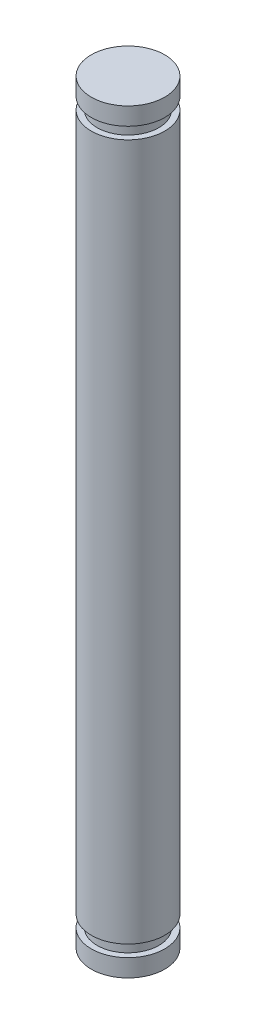
ISO-10303-21;
HEADER;
FILE_DESCRIPTION(('STEP AP214'),'2;1');
FILE_NAME('part.step','',(''),(''),'','','');
FILE_SCHEMA(('AUTOMOTIVE_DESIGN { 1 0 10303 214 1 1 1 1 }'));
ENDSEC;
DATA;
#1=APPLICATION_CONTEXT('core data for automotive mechanical design processes');
#2=APPLICATION_PROTOCOL_DEFINITION('international standard','automotive_design',2000,#1);
#3=PRODUCT_CONTEXT('',#1,'mechanical');
#4=PRODUCT('Part','Part','',(#3));
#5=PRODUCT_RELATED_PRODUCT_CATEGORY('part','',(#4));
#6=PRODUCT_DEFINITION_FORMATION('','',#4);
#7=PRODUCT_DEFINITION_CONTEXT('part definition',#1,'design');
#8=PRODUCT_DEFINITION('design','',#6,#7);
#9=PRODUCT_DEFINITION_SHAPE('','',#8);
#10=(LENGTH_UNIT() NAMED_UNIT(*) SI_UNIT(.MILLI.,.METRE.));
#11=(NAMED_UNIT(*) PLANE_ANGLE_UNIT() SI_UNIT($,.RADIAN.));
#12=(NAMED_UNIT(*) SI_UNIT($,.STERADIAN.) SOLID_ANGLE_UNIT());
#13=UNCERTAINTY_MEASURE_WITH_UNIT(LENGTH_MEASURE(1.E-05),#10,'distance_accuracy_value','');
#14=(GEOMETRIC_REPRESENTATION_CONTEXT(3) GLOBAL_UNCERTAINTY_ASSIGNED_CONTEXT((#13)) GLOBAL_UNIT_ASSIGNED_CONTEXT((#10,
#11,#12)) REPRESENTATION_CONTEXT('',''));
#15=CARTESIAN_POINT('',(0.,0.,0.));
#16=DIRECTION('',(0.,0.,1.));
#17=DIRECTION('',(1.,0.,0.));
#18=AXIS2_PLACEMENT_3D('',#15,#16,#17);
#19=CARTESIAN_POINT('',(0.,60.198,0.));
#20=DIRECTION('',(0.,-1.,0.));
#21=DIRECTION('',(0.,0.,-1.));
#22=AXIS2_PLACEMENT_3D('',#19,#20,#21);
#23=CYLINDRICAL_SURFACE('',#22,3.175);
#24=CARTESIAN_POINT('',(0.,60.198,0.));
#25=DIRECTION('',(0.,1.,0.));
#26=DIRECTION('',(0.,0.,1.));
#27=AXIS2_PLACEMENT_3D('',#24,#25,#26);
#28=CIRCLE('',#27,3.175);
#29=CARTESIAN_POINT('',(0.,60.198,-3.175));
#30=VERTEX_POINT('',#29);
#31=EDGE_CURVE('E51',#30,#30,#28,.T.);
#32=CARTESIAN_POINT('',(0.,0.,0.));
#33=DIRECTION('',(0.,1.,0.));
#34=DIRECTION('',(0.,0.,1.));
#35=AXIS2_PLACEMENT_3D('',#32,#33,#34);
#36=CIRCLE('',#35,3.175);
#37=CARTESIAN_POINT('',(0.,0.,-3.175));
#38=VERTEX_POINT('',#37);
#39=EDGE_CURVE('E42',#38,#38,#36,.T.);
#40=CARTESIAN_POINT('',(0.,60.198,-3.175));
#41=CARTESIAN_POINT('',(0.,59.5709375,-3.175));
#42=CARTESIAN_POINT('',(0.,58.943875,-3.175));
#43=CARTESIAN_POINT('',(0.,57.68975,-3.175));
#44=CARTESIAN_POINT('',(0.,57.0626875,-3.175));
#45=CARTESIAN_POINT('',(0.,55.8085625,-3.175));
#46=CARTESIAN_POINT('',(0.,55.1815,-3.175));
#47=CARTESIAN_POINT('',(0.,53.927375,-3.175));
#48=CARTESIAN_POINT('',(0.,53.3003125,-3.175));
#49=CARTESIAN_POINT('',(0.,52.0461875,-3.175));
#50=CARTESIAN_POINT('',(0.,51.419125,-3.175));
#51=CARTESIAN_POINT('',(0.,50.165,-3.175));
#52=CARTESIAN_POINT('',(0.,49.5379375,-3.175));
#53=CARTESIAN_POINT('',(0.,48.2838125,-3.175));
#54=CARTESIAN_POINT('',(0.,47.65675,-3.175));
#55=CARTESIAN_POINT('',(0.,46.402625,-3.175));
#56=CARTESIAN_POINT('',(0.,45.7755625,-3.175));
#57=CARTESIAN_POINT('',(0.,44.5214375,-3.175));
#58=CARTESIAN_POINT('',(0.,43.894375,-3.175));
#59=CARTESIAN_POINT('',(0.,42.64025,-3.175));
#60=CARTESIAN_POINT('',(0.,42.0131875,-3.175));
#61=CARTESIAN_POINT('',(0.,40.7590625,-3.175));
#62=CARTESIAN_POINT('',(0.,40.132,-3.175));
#63=CARTESIAN_POINT('',(0.,38.877875,-3.175));
#64=CARTESIAN_POINT('',(0.,38.2508125,-3.175));
#65=CARTESIAN_POINT('',(0.,36.9966875,-3.175));
#66=CARTESIAN_POINT('',(0.,36.369625,-3.175));
#67=CARTESIAN_POINT('',(0.,35.1155,-3.175));
#68=CARTESIAN_POINT('',(0.,34.4884375,-3.175));
#69=CARTESIAN_POINT('',(0.,33.2343125,-3.175));
#70=CARTESIAN_POINT('',(0.,32.60725,-3.175));
#71=CARTESIAN_POINT('',(0.,31.353125,-3.175));
#72=CARTESIAN_POINT('',(0.,30.7260625,-3.175));
#73=CARTESIAN_POINT('',(0.,29.4719375,-3.175));
#74=CARTESIAN_POINT('',(0.,28.844875,-3.175));
#75=CARTESIAN_POINT('',(0.,27.59075,-3.175));
#76=CARTESIAN_POINT('',(0.,26.9636875,-3.175));
#77=CARTESIAN_POINT('',(0.,25.7095625,-3.175));
#78=CARTESIAN_POINT('',(0.,25.0825,-3.175));
#79=CARTESIAN_POINT('',(0.,23.828375,-3.175));
#80=CARTESIAN_POINT('',(0.,23.2013125,-3.175));
#81=CARTESIAN_POINT('',(0.,21.9471875,-3.175));
#82=CARTESIAN_POINT('',(0.,21.320125,-3.175));
#83=CARTESIAN_POINT('',(0.,20.066,-3.175));
#84=CARTESIAN_POINT('',(0.,19.4389375,-3.175));
#85=CARTESIAN_POINT('',(0.,18.1848125,-3.175));
#86=CARTESIAN_POINT('',(0.,17.55775,-3.175));
#87=CARTESIAN_POINT('',(0.,16.303625,-3.175));
#88=CARTESIAN_POINT('',(0.,15.6765625,-3.175));
#89=CARTESIAN_POINT('',(0.,14.4224375,-3.175));
#90=CARTESIAN_POINT('',(0.,13.795375,-3.175));
#91=CARTESIAN_POINT('',(0.,12.54125,-3.175));
#92=CARTESIAN_POINT('',(0.,11.9141875,-3.175));
#93=CARTESIAN_POINT('',(0.,10.6600625,-3.175));
#94=CARTESIAN_POINT('',(0.,10.033,-3.175));
#95=CARTESIAN_POINT('',(0.,8.778875,-3.175));
#96=CARTESIAN_POINT('',(0.,8.1518125,-3.175));
#97=CARTESIAN_POINT('',(0.,6.89768749999999,-3.175));
#98=CARTESIAN_POINT('',(0.,6.27062499999999,-3.175));
#99=CARTESIAN_POINT('',(0.,5.01649999999999,-3.175));
#100=CARTESIAN_POINT('',(0.,4.38943749999999,-3.175));
#101=CARTESIAN_POINT('',(0.,3.13531249999999,-3.175));
#102=CARTESIAN_POINT('',(0.,2.50824999999999,-3.175));
#103=CARTESIAN_POINT('',(0.,1.25412499999999,-3.175));
#104=CARTESIAN_POINT('',(0.,0.627062499999992,-3.175));
#105=CARTESIAN_POINT('',(0.,0.,-3.175));
#106=B_SPLINE_CURVE_WITH_KNOTS('',3,(#40,#41,#42,#43,#44,#45,#46,#47,#48,#49,#50,#51,#52,#53,
#54,#55,#56,#57,#58,#59,#60,#61,#62,#63,#64,#65,#66,#67,#68,#69,#70,#71,#72,#73,#74,#75,#76,#77,
#78,#79,#80,#81,#82,#83,#84,#85,#86,#87,#88,#89,#90,#91,#92,#93,#94,#95,#96,#97,#98,#99,#100,
#101,#102,#103,#104,#105),.UNSPECIFIED.,.F.,.F.,(4,2,2,2,2,2,2,2,2,2,2,2,2,2,2,2,2,2,2,2,2,2,2,
2,2,2,2,2,2,2,2,2,4),(0.,1.8811875,3.762375,5.6435625,7.52475,9.4059375,11.287125,13.1683125,
15.0495,16.9306875,18.811875,20.6930625,22.57425,24.4554375,26.336625,28.2178125,30.099,
31.9801875,33.861375,35.7425625,37.62375,39.5049375,41.386125,43.2673125,45.1485,47.0296875,
48.910875,50.7920625,52.67325,54.5544375,56.435625,58.3168125,60.198),.UNSPECIFIED.);
#107=EDGE_CURVE('BSEAM39',#30,#38,#106,.T.);
#108=ORIENTED_EDGE('',*,*,#31,.F.);
#109=ORIENTED_EDGE('',*,*,#39,.T.);
#110=ORIENTED_EDGE('',*,*,#107,.T.);
#111=ORIENTED_EDGE('',*,*,#107,.F.);
#112=EDGE_LOOP('',(#108,#110,#109,#111));
#113=FACE_BOUND('',#112,.T.);
#114=ADVANCED_FACE('F39',(#113),#23,.T.);
#115=CARTESIAN_POINT('',(0.,60.198,0.));
#116=DIRECTION('',(0.,1.,0.));
#117=DIRECTION('',(0.,0.,1.));
#118=AXIS2_PLACEMENT_3D('',#115,#116,#117);
#119=PLANE('',#118);
#120=CARTESIAN_POINT('',(0.,60.198,0.));
#121=DIRECTION('',(0.,1.,0.));
#122=DIRECTION('',(0.,0.,1.));
#123=AXIS2_PLACEMENT_3D('',#120,#121,#122);
#124=CIRCLE('',#123,2.667);
#125=CARTESIAN_POINT('',(0.,60.198,2.667));
#126=VERTEX_POINT('',#125);
#127=EDGE_CURVE('E46',#126,#126,#124,.T.);
#128=ORIENTED_EDGE('',*,*,#127,.F.);
#129=EDGE_LOOP('',(#128));
#130=FACE_BOUND('',#129,.T.);
#131=ORIENTED_EDGE('',*,*,#31,.T.);
#132=EDGE_LOOP('',(#131));
#133=FACE_BOUND('',#132,.T.);
#134=ADVANCED_FACE('F75',(#130,#133),#119,.T.);
#135=CARTESIAN_POINT('',(0.,0.,0.));
#136=DIRECTION('',(0.,1.,0.));
#137=DIRECTION('',(0.,0.,1.));
#138=AXIS2_PLACEMENT_3D('',#135,#136,#137);
#139=PLANE('',#138);
#140=CARTESIAN_POINT('',(0.,0.,0.));
#141=DIRECTION('',(0.,-1.,0.));
#142=DIRECTION('',(0.,0.,-1.));
#143=AXIS2_PLACEMENT_3D('',#140,#141,#142);
#144=CIRCLE('',#143,2.667);
#145=CARTESIAN_POINT('',(0.,0.,-2.667));
#146=VERTEX_POINT('',#145);
#147=EDGE_CURVE('E10',#146,#146,#144,.T.);
#148=ORIENTED_EDGE('',*,*,#147,.F.);
#149=EDGE_LOOP('',(#148));
#150=FACE_BOUND('',#149,.T.);
#151=ORIENTED_EDGE('',*,*,#39,.F.);
#152=EDGE_LOOP('',(#151));
#153=FACE_BOUND('',#152,.T.);
#154=ADVANCED_FACE('F72',(#150,#153),#139,.F.);
#155=CARTESIAN_POINT('',(0.,61.214,0.));
#156=DIRECTION('',(0.,-1.,0.));
#157=DIRECTION('',(0.,0.,-1.));
#158=AXIS2_PLACEMENT_3D('',#155,#156,#157);
#159=CYLINDRICAL_SURFACE('',#158,2.667);
#160=CARTESIAN_POINT('',(0.,61.214,0.));
#161=DIRECTION('',(0.,1.,0.));
#162=DIRECTION('',(0.,0.,1.));
#163=AXIS2_PLACEMENT_3D('',#160,#161,#162);
#164=CIRCLE('',#163,2.667);
#165=CARTESIAN_POINT('',(0.,61.214,2.667));
#166=VERTEX_POINT('',#165);
#167=EDGE_CURVE('E60',#166,#166,#164,.T.);
#168=ORIENTED_EDGE('',*,*,#167,.F.);
#169=EDGE_LOOP('',(#168));
#170=FACE_BOUND('',#169,.T.);
#171=ORIENTED_EDGE('',*,*,#127,.T.);
#172=EDGE_LOOP('',(#171));
#173=FACE_BOUND('',#172,.T.);
#174=ADVANCED_FACE('F74',(#170,#173),#159,.T.);
#175=CARTESIAN_POINT('',(0.,62.738,0.));
#176=DIRECTION('',(0.,-1.,0.));
#177=DIRECTION('',(0.,0.,-1.));
#178=AXIS2_PLACEMENT_3D('',#175,#176,#177);
#179=CYLINDRICAL_SURFACE('',#178,3.175);
#180=CARTESIAN_POINT('',(0.,62.738,0.));
#181=DIRECTION('',(0.,1.,0.));
#182=DIRECTION('',(0.,0.,1.));
#183=AXIS2_PLACEMENT_3D('',#180,#181,#182);
#184=CIRCLE('',#183,3.175);
#185=CARTESIAN_POINT('',(0.,62.738,-3.175));
#186=VERTEX_POINT('',#185);
#187=EDGE_CURVE('E57',#186,#186,#184,.T.);
#188=CARTESIAN_POINT('',(0.,61.214,0.));
#189=DIRECTION('',(0.,1.,0.));
#190=DIRECTION('',(0.,0.,1.));
#191=AXIS2_PLACEMENT_3D('',#188,#189,#190);
#192=CIRCLE('',#191,3.175);
#193=CARTESIAN_POINT('',(0.,61.214,-3.175));
#194=VERTEX_POINT('',#193);
#195=EDGE_CURVE('E61',#194,#194,#192,.T.);
#196=CARTESIAN_POINT('',(0.,62.738,-3.175));
#197=CARTESIAN_POINT('',(0.,62.722125,-3.175));
#198=CARTESIAN_POINT('',(0.,62.70625,-3.175));
#199=CARTESIAN_POINT('',(0.,62.6745,-3.175));
#200=CARTESIAN_POINT('',(0.,62.658625,-3.175));
#201=CARTESIAN_POINT('',(0.,62.626875,-3.175));
#202=CARTESIAN_POINT('',(0.,62.611,-3.175));
#203=CARTESIAN_POINT('',(0.,62.57925,-3.175));
#204=CARTESIAN_POINT('',(0.,62.563375,-3.175));
#205=CARTESIAN_POINT('',(0.,62.531625,-3.175));
#206=CARTESIAN_POINT('',(0.,62.51575,-3.175));
#207=CARTESIAN_POINT('',(0.,62.484,-3.175));
#208=CARTESIAN_POINT('',(0.,62.468125,-3.175));
#209=CARTESIAN_POINT('',(0.,62.436375,-3.175));
#210=CARTESIAN_POINT('',(0.,62.4205,-3.175));
#211=CARTESIAN_POINT('',(0.,62.38875,-3.175));
#212=CARTESIAN_POINT('',(0.,62.372875,-3.175));
#213=CARTESIAN_POINT('',(0.,62.341125,-3.175));
#214=CARTESIAN_POINT('',(0.,62.32525,-3.175));
#215=CARTESIAN_POINT('',(0.,62.2935,-3.175));
#216=CARTESIAN_POINT('',(0.,62.277625,-3.175));
#217=CARTESIAN_POINT('',(0.,62.245875,-3.175));
#218=CARTESIAN_POINT('',(0.,62.23,-3.175));
#219=CARTESIAN_POINT('',(0.,62.19825,-3.175));
#220=CARTESIAN_POINT('',(0.,62.182375,-3.175));
#221=CARTESIAN_POINT('',(0.,62.150625,-3.175));
#222=CARTESIAN_POINT('',(0.,62.13475,-3.175));
#223=CARTESIAN_POINT('',(0.,62.103,-3.175));
#224=CARTESIAN_POINT('',(0.,62.087125,-3.175));
#225=CARTESIAN_POINT('',(0.,62.055375,-3.175));
#226=CARTESIAN_POINT('',(0.,62.0395,-3.175));
#227=CARTESIAN_POINT('',(0.,62.00775,-3.175));
#228=CARTESIAN_POINT('',(0.,61.991875,-3.175));
#229=CARTESIAN_POINT('',(0.,61.960125,-3.175));
#230=CARTESIAN_POINT('',(0.,61.94425,-3.175));
#231=CARTESIAN_POINT('',(0.,61.9125,-3.175));
#232=CARTESIAN_POINT('',(0.,61.896625,-3.175));
#233=CARTESIAN_POINT('',(0.,61.864875,-3.175));
#234=CARTESIAN_POINT('',(0.,61.849,-3.175));
#235=CARTESIAN_POINT('',(0.,61.81725,-3.175));
#236=CARTESIAN_POINT('',(0.,61.801375,-3.175));
#237=CARTESIAN_POINT('',(0.,61.769625,-3.175));
#238=CARTESIAN_POINT('',(0.,61.75375,-3.175));
#239=CARTESIAN_POINT('',(0.,61.722,-3.175));
#240=CARTESIAN_POINT('',(0.,61.706125,-3.175));
#241=CARTESIAN_POINT('',(0.,61.674375,-3.175));
#242=CARTESIAN_POINT('',(0.,61.6585,-3.175));
#243=CARTESIAN_POINT('',(0.,61.62675,-3.175));
#244=CARTESIAN_POINT('',(0.,61.610875,-3.175));
#245=CARTESIAN_POINT('',(0.,61.579125,-3.175));
#246=CARTESIAN_POINT('',(0.,61.56325,-3.175));
#247=CARTESIAN_POINT('',(0.,61.5315,-3.175));
#248=CARTESIAN_POINT('',(0.,61.515625,-3.175));
#249=CARTESIAN_POINT('',(0.,61.483875,-3.175));
#250=CARTESIAN_POINT('',(0.,61.468,-3.175));
#251=CARTESIAN_POINT('',(0.,61.43625,-3.175));
#252=CARTESIAN_POINT('',(0.,61.420375,-3.175));
#253=CARTESIAN_POINT('',(0.,61.388625,-3.175));
#254=CARTESIAN_POINT('',(0.,61.37275,-3.175));
#255=CARTESIAN_POINT('',(0.,61.341,-3.175));
#256=CARTESIAN_POINT('',(0.,61.325125,-3.175));
#257=CARTESIAN_POINT('',(0.,61.293375,-3.175));
#258=CARTESIAN_POINT('',(0.,61.2775,-3.175));
#259=CARTESIAN_POINT('',(0.,61.24575,-3.175));
#260=CARTESIAN_POINT('',(0.,61.229875,-3.175));
#261=CARTESIAN_POINT('',(0.,61.214,-3.175));
#262=B_SPLINE_CURVE_WITH_KNOTS('',3,(#196,#197,#198,#199,#200,#201,#202,#203,#204,#205,#206,
#207,#208,#209,#210,#211,#212,#213,#214,#215,#216,#217,#218,#219,#220,#221,#222,#223,#224,#225,
#226,#227,#228,#229,#230,#231,#232,#233,#234,#235,#236,#237,#238,#239,#240,#241,#242,#243,#244,
#245,#246,#247,#248,#249,#250,#251,#252,#253,#254,#255,#256,#257,#258,#259,#260,#261),
.UNSPECIFIED.,.F.,.F.,(4,2,2,2,2,2,2,2,2,2,2,2,2,2,2,2,2,2,2,2,2,2,2,2,2,2,2,2,2,2,2,2,4),(0.,
0.0476249999999956,0.0952499999999912,0.142874999999987,0.190499999999996,0.238124999999992,
0.285749999999994,0.33337499999999,0.380999999999992,0.428624999999988,0.476249999999991,
0.523874999999993,0.571499999999989,0.619124999999991,0.666749999999994,0.714374999999989,
0.761999999999992,0.809624999999987,0.85724999999999,0.904874999999993,0.952499999999988,
1.00012499999999,1.04774999999999,1.09537499999999,1.14299999999999,1.19062499999999,
1.23824999999999,1.28587499999999,1.33349999999999,1.38112499999999,1.42874999999999,
1.47637499999999,1.52399999999999),.UNSPECIFIED.);
#263=EDGE_CURVE('BSEAM82',#186,#194,#262,.T.);
#264=ORIENTED_EDGE('',*,*,#187,.F.);
#265=ORIENTED_EDGE('',*,*,#195,.T.);
#266=ORIENTED_EDGE('',*,*,#263,.T.);
#267=ORIENTED_EDGE('',*,*,#263,.F.);
#268=EDGE_LOOP('',(#264,#266,#265,#267));
#269=FACE_BOUND('',#268,.T.);
#270=ADVANCED_FACE('F82',(#269),#179,.T.);
#271=CARTESIAN_POINT('',(0.,62.738,0.));
#272=DIRECTION('',(0.,1.,0.));
#273=DIRECTION('',(0.,0.,1.));
#274=AXIS2_PLACEMENT_3D('',#271,#272,#273);
#275=PLANE('',#274);
#276=ORIENTED_EDGE('',*,*,#187,.T.);
#277=EDGE_LOOP('',(#276));
#278=FACE_BOUND('',#277,.T.);
#279=ADVANCED_FACE('F109',(#278),#275,.T.);
#280=CARTESIAN_POINT('',(0.,61.214,0.));
#281=DIRECTION('',(0.,1.,0.));
#282=DIRECTION('',(0.,0.,1.));
#283=AXIS2_PLACEMENT_3D('',#280,#281,#282);
#284=PLANE('',#283);
#285=ORIENTED_EDGE('',*,*,#167,.T.);
#286=EDGE_LOOP('',(#285));
#287=FACE_BOUND('',#286,.T.);
#288=ORIENTED_EDGE('',*,*,#195,.F.);
#289=EDGE_LOOP('',(#288));
#290=FACE_BOUND('',#289,.T.);
#291=ADVANCED_FACE('F117',(#287,#290),#284,.F.);
#292=CARTESIAN_POINT('',(0.,-1.016,0.));
#293=DIRECTION('',(0.,1.,0.));
#294=DIRECTION('',(0.,0.,1.));
#295=AXIS2_PLACEMENT_3D('',#292,#293,#294);
#296=CYLINDRICAL_SURFACE('',#295,2.667);
#297=CARTESIAN_POINT('',(0.,-1.016,0.));
#298=DIRECTION('',(0.,-1.,0.));
#299=DIRECTION('',(0.,0.,-1.));
#300=AXIS2_PLACEMENT_3D('',#297,#298,#299);
#301=CIRCLE('',#300,2.667);
#302=CARTESIAN_POINT('',(0.,-1.016,-2.667));
#303=VERTEX_POINT('',#302);
#304=EDGE_CURVE('E55',#303,#303,#301,.T.);
#305=ORIENTED_EDGE('',*,*,#304,.F.);
#306=EDGE_LOOP('',(#305));
#307=FACE_BOUND('',#306,.T.);
#308=ORIENTED_EDGE('',*,*,#147,.T.);
#309=EDGE_LOOP('',(#308));
#310=FACE_BOUND('',#309,.T.);
#311=ADVANCED_FACE('F125',(#307,#310),#296,.T.);
#312=CARTESIAN_POINT('',(0.,-2.54,0.));
#313=DIRECTION('',(0.,1.,0.));
#314=DIRECTION('',(0.,0.,1.));
#315=AXIS2_PLACEMENT_3D('',#312,#313,#314);
#316=CYLINDRICAL_SURFACE('',#315,3.175);
#317=CARTESIAN_POINT('',(0.,-2.54,0.));
#318=DIRECTION('',(0.,-1.,0.));
#319=DIRECTION('',(0.,0.,-1.));
#320=AXIS2_PLACEMENT_3D('',#317,#318,#319);
#321=CIRCLE('',#320,3.175);
#322=CARTESIAN_POINT('',(0.,-2.54,3.175));
#323=VERTEX_POINT('',#322);
#324=EDGE_CURVE('E177',#323,#323,#321,.T.);
#325=CARTESIAN_POINT('',(0.,-1.016,0.));
#326=DIRECTION('',(0.,-1.,0.));
#327=DIRECTION('',(0.,0.,-1.));
#328=AXIS2_PLACEMENT_3D('',#325,#326,#327);
#329=CIRCLE('',#328,3.175);
#330=CARTESIAN_POINT('',(0.,-1.016,3.175));
#331=VERTEX_POINT('',#330);
#332=EDGE_CURVE('E175',#331,#331,#329,.T.);
#333=CARTESIAN_POINT('',(0.,-2.54,3.175));
#334=CARTESIAN_POINT('',(0.,-2.524125,3.175));
#335=CARTESIAN_POINT('',(0.,-2.50825,3.175));
#336=CARTESIAN_POINT('',(0.,-2.4765,3.175));
#337=CARTESIAN_POINT('',(0.,-2.460625,3.175));
#338=CARTESIAN_POINT('',(0.,-2.428875,3.175));
#339=CARTESIAN_POINT('',(0.,-2.413,3.175));
#340=CARTESIAN_POINT('',(0.,-2.38125,3.175));
#341=CARTESIAN_POINT('',(0.,-2.365375,3.175));
#342=CARTESIAN_POINT('',(0.,-2.333625,3.175));
#343=CARTESIAN_POINT('',(0.,-2.31775,3.175));
#344=CARTESIAN_POINT('',(0.,-2.286,3.175));
#345=CARTESIAN_POINT('',(0.,-2.270125,3.175));
#346=CARTESIAN_POINT('',(0.,-2.238375,3.175));
#347=CARTESIAN_POINT('',(0.,-2.2225,3.175));
#348=CARTESIAN_POINT('',(0.,-2.19075,3.175));
#349=CARTESIAN_POINT('',(0.,-2.174875,3.175));
#350=CARTESIAN_POINT('',(0.,-2.143125,3.175));
#351=CARTESIAN_POINT('',(0.,-2.12725,3.175));
#352=CARTESIAN_POINT('',(0.,-2.0955,3.175));
#353=CARTESIAN_POINT('',(0.,-2.079625,3.175));
#354=CARTESIAN_POINT('',(0.,-2.047875,3.175));
#355=CARTESIAN_POINT('',(0.,-2.032,3.175));
#356=CARTESIAN_POINT('',(0.,-2.00025,3.175));
#357=CARTESIAN_POINT('',(0.,-1.984375,3.175));
#358=CARTESIAN_POINT('',(0.,-1.952625,3.175));
#359=CARTESIAN_POINT('',(0.,-1.93675,3.175));
#360=CARTESIAN_POINT('',(0.,-1.905,3.175));
#361=CARTESIAN_POINT('',(0.,-1.889125,3.175));
#362=CARTESIAN_POINT('',(0.,-1.857375,3.175));
#363=CARTESIAN_POINT('',(0.,-1.8415,3.175));
#364=CARTESIAN_POINT('',(0.,-1.80975,3.175));
#365=CARTESIAN_POINT('',(0.,-1.793875,3.175));
#366=CARTESIAN_POINT('',(0.,-1.762125,3.175));
#367=CARTESIAN_POINT('',(0.,-1.74625,3.175));
#368=CARTESIAN_POINT('',(0.,-1.7145,3.175));
#369=CARTESIAN_POINT('',(0.,-1.698625,3.175));
#370=CARTESIAN_POINT('',(0.,-1.666875,3.175));
#371=CARTESIAN_POINT('',(0.,-1.651,3.175));
#372=CARTESIAN_POINT('',(0.,-1.61925,3.175));
#373=CARTESIAN_POINT('',(0.,-1.603375,3.175));
#374=CARTESIAN_POINT('',(0.,-1.571625,3.175));
#375=CARTESIAN_POINT('',(0.,-1.55575,3.175));
#376=CARTESIAN_POINT('',(0.,-1.524,3.175));
#377=CARTESIAN_POINT('',(0.,-1.508125,3.175));
#378=CARTESIAN_POINT('',(0.,-1.476375,3.175));
#379=CARTESIAN_POINT('',(0.,-1.4605,3.175));
#380=CARTESIAN_POINT('',(0.,-1.42875,3.175));
#381=CARTESIAN_POINT('',(0.,-1.412875,3.175));
#382=CARTESIAN_POINT('',(0.,-1.381125,3.175));
#383=CARTESIAN_POINT('',(0.,-1.36525,3.175));
#384=CARTESIAN_POINT('',(0.,-1.3335,3.175));
#385=CARTESIAN_POINT('',(0.,-1.317625,3.175));
#386=CARTESIAN_POINT('',(0.,-1.285875,3.175));
#387=CARTESIAN_POINT('',(0.,-1.27,3.175));
#388=CARTESIAN_POINT('',(0.,-1.23825,3.175));
#389=CARTESIAN_POINT('',(0.,-1.222375,3.175));
#390=CARTESIAN_POINT('',(0.,-1.190625,3.175));
#391=CARTESIAN_POINT('',(0.,-1.17475,3.175));
#392=CARTESIAN_POINT('',(0.,-1.143,3.175));
#393=CARTESIAN_POINT('',(0.,-1.127125,3.175));
#394=CARTESIAN_POINT('',(0.,-1.095375,3.175));
#395=CARTESIAN_POINT('',(0.,-1.0795,3.175));
#396=CARTESIAN_POINT('',(0.,-1.04775,3.175));
#397=CARTESIAN_POINT('',(0.,-1.031875,3.175));
#398=CARTESIAN_POINT('',(0.,-1.016,3.175));
#399=B_SPLINE_CURVE_WITH_KNOTS('',3,(#333,#334,#335,#336,#337,#338,#339,#340,#341,#342,#343,
#344,#345,#346,#347,#348,#349,#350,#351,#352,#353,#354,#355,#356,#357,#358,#359,#360,#361,#362,
#363,#364,#365,#366,#367,#368,#369,#370,#371,#372,#373,#374,#375,#376,#377,#378,#379,#380,#381,
#382,#383,#384,#385,#386,#387,#388,#389,#390,#391,#392,#393,#394,#395,#396,#397,#398),
.UNSPECIFIED.,.F.,.F.,(4,2,2,2,2,2,2,2,2,2,2,2,2,2,2,2,2,2,2,2,2,2,2,2,2,2,2,2,2,2,2,2,4),(0.,
0.0476250000000004,0.0952500000000003,0.142875,0.1905,0.238125,0.28575,0.333375,0.381,0.428625,
0.47625,0.523875,0.5715,0.619125,0.66675,0.714375,0.762,0.809625,0.85725,0.904875,0.9525,
1.000125,1.04775,1.095375,1.143,1.190625,1.23825,1.285875,1.3335,1.381125,1.42875,1.476375,
1.524),.UNSPECIFIED.);
#400=EDGE_CURVE('BSEAM137',#323,#331,#399,.T.);
#401=ORIENTED_EDGE('',*,*,#324,.F.);
#402=ORIENTED_EDGE('',*,*,#332,.T.);
#403=ORIENTED_EDGE('',*,*,#400,.T.);
#404=ORIENTED_EDGE('',*,*,#400,.F.);
#405=EDGE_LOOP('',(#401,#403,#402,#404));
#406=FACE_BOUND('',#405,.T.);
#407=ADVANCED_FACE('F137',(#406),#316,.T.);
#408=CARTESIAN_POINT('',(0.,-2.54,0.));
#409=DIRECTION('',(0.,-1.,0.));
#410=DIRECTION('',(0.,0.,-1.));
#411=AXIS2_PLACEMENT_3D('',#408,#409,#410);
#412=PLANE('',#411);
#413=ORIENTED_EDGE('',*,*,#324,.T.);
#414=EDGE_LOOP('',(#413));
#415=FACE_BOUND('',#414,.T.);
#416=ADVANCED_FACE('F147',(#415),#412,.T.);
#417=CARTESIAN_POINT('',(0.,-1.016,0.));
#418=DIRECTION('',(0.,-1.,0.));
#419=DIRECTION('',(0.,0.,-1.));
#420=AXIS2_PLACEMENT_3D('',#417,#418,#419);
#421=PLANE('',#420);
#422=ORIENTED_EDGE('',*,*,#304,.T.);
#423=EDGE_LOOP('',(#422));
#424=FACE_BOUND('',#423,.T.);
#425=ORIENTED_EDGE('',*,*,#332,.F.);
#426=EDGE_LOOP('',(#425));
#427=FACE_BOUND('',#426,.T.);
#428=ADVANCED_FACE('F157',(#424,#427),#421,.F.);
#429=CLOSED_SHELL('',(#114,#134,#154,#174,#270,#279,#291,#311,#407,#416,#428));
#430=MANIFOLD_SOLID_BREP('B2',#429);
#431=ADVANCED_BREP_SHAPE_REPRESENTATION('',(#18,#430),#14);
#432=SHAPE_DEFINITION_REPRESENTATION(#9,#431);
ENDSEC;
END-ISO-10303-21;
